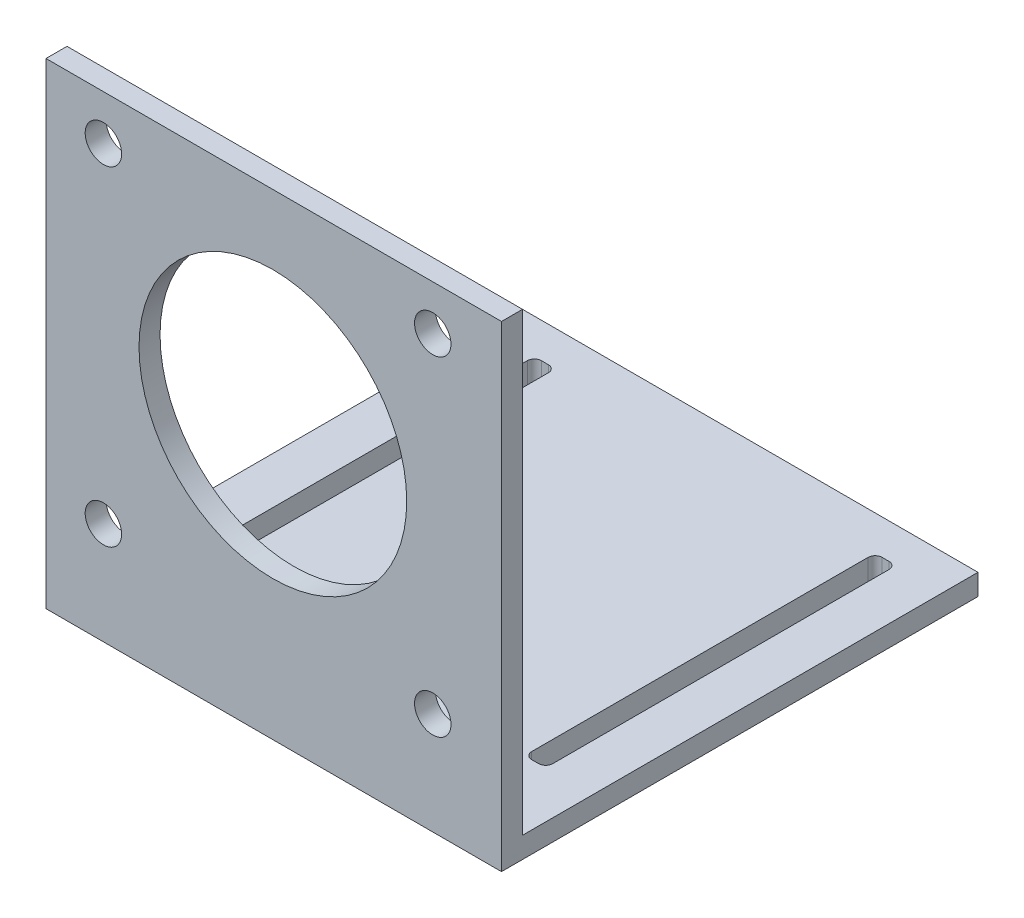
ISO-10303-21;
HEADER;
FILE_DESCRIPTION(('STEP AP214'),'2;1');
FILE_NAME('part.step','',(''),(''),'','','');
FILE_SCHEMA(('AUTOMOTIVE_DESIGN { 1 0 10303 214 1 1 1 1 }'));
ENDSEC;
DATA;
#1=APPLICATION_CONTEXT('core data for automotive mechanical design processes');
#2=APPLICATION_PROTOCOL_DEFINITION('international standard','automotive_design',2000,#1);
#3=PRODUCT_CONTEXT('',#1,'mechanical');
#4=PRODUCT('Part','Part','',(#3));
#5=PRODUCT_RELATED_PRODUCT_CATEGORY('part','',(#4));
#6=PRODUCT_DEFINITION_FORMATION('','',#4);
#7=PRODUCT_DEFINITION_CONTEXT('part definition',#1,'design');
#8=PRODUCT_DEFINITION('design','',#6,#7);
#9=PRODUCT_DEFINITION_SHAPE('','',#8);
#10=(LENGTH_UNIT() NAMED_UNIT(*) SI_UNIT(.MILLI.,.METRE.));
#11=(NAMED_UNIT(*) PLANE_ANGLE_UNIT() SI_UNIT($,.RADIAN.));
#12=(NAMED_UNIT(*) SI_UNIT($,.STERADIAN.) SOLID_ANGLE_UNIT());
#13=UNCERTAINTY_MEASURE_WITH_UNIT(LENGTH_MEASURE(1.E-05),#10,'distance_accuracy_value','');
#14=(GEOMETRIC_REPRESENTATION_CONTEXT(3) GLOBAL_UNCERTAINTY_ASSIGNED_CONTEXT((#13)) GLOBAL_UNIT_ASSIGNED_CONTEXT((#10,
#11,#12)) REPRESENTATION_CONTEXT('',''));
#15=CARTESIAN_POINT('',(0.,0.,0.));
#16=DIRECTION('',(0.,0.,1.));
#17=DIRECTION('',(1.,0.,0.));
#18=AXIS2_PLACEMENT_3D('',#15,#16,#17);
#19=CARTESIAN_POINT('',(65.,58.3348706702819,3.70617289525367));
#20=DIRECTION('',(0.,-1.,0.));
#21=DIRECTION('',(0.,0.,-1.));
#22=AXIS2_PLACEMENT_3D('',#19,#20,#21);
#23=PLANE('',#22);
#24=DIRECTION('',(0.,0.,1.));
#25=VECTOR('',#24,1.);
#26=CARTESIAN_POINT('',(0.,58.3348706702819,3.70617289525367));
#27=LINE('',#26,#25);
#28=CARTESIAN_POINT('',(0.,58.3348706702819,3.70617289525367));
#29=VERTEX_POINT('',#28);
#30=CARTESIAN_POINT('',(0.,58.3348706702819,6.70617289525367));
#31=VERTEX_POINT('',#30);
#32=EDGE_CURVE('E216',#29,#31,#27,.T.);
#33=ORIENTED_EDGE('',*,*,#32,.T.);
#34=DIRECTION('',(-1.,0.,0.));
#35=VECTOR('',#34,1.);
#36=CARTESIAN_POINT('',(65.,58.3348706702819,6.70617289525367));
#37=LINE('',#36,#35);
#38=CARTESIAN_POINT('',(65.,58.3348706702819,6.70617289525367));
#39=VERTEX_POINT('',#38);
#40=EDGE_CURVE('E197',#39,#31,#37,.T.);
#41=ORIENTED_EDGE('',*,*,#40,.F.);
#42=DIRECTION('',(0.,0.,1.));
#43=VECTOR('',#42,1.);
#44=CARTESIAN_POINT('',(65.,58.3348706702819,3.70617289525367));
#45=LINE('',#44,#43);
#46=CARTESIAN_POINT('',(65.,58.3348706702819,3.70617289525367));
#47=VERTEX_POINT('',#46);
#48=EDGE_CURVE('E204',#47,#39,#45,.T.);
#49=ORIENTED_EDGE('',*,*,#48,.F.);
#50=DIRECTION('',(-1.,0.,0.));
#51=VECTOR('',#50,1.);
#52=CARTESIAN_POINT('',(65.,58.3348706702819,3.70617289525367));
#53=LINE('',#52,#51);
#54=EDGE_CURVE('E367',#47,#29,#53,.T.);
#55=ORIENTED_EDGE('',*,*,#54,.T.);
#56=EDGE_LOOP('',(#33,#41,#49,#55));
#57=FACE_BOUND('',#56,.T.);
#58=ADVANCED_FACE('F43',(#57),#23,.F.);
#59=CARTESIAN_POINT('',(65.,58.3348706702819,6.70617289525367));
#60=DIRECTION('',(0.,0.,-1.));
#61=DIRECTION('',(0.,1.,0.));
#62=AXIS2_PLACEMENT_3D('',#59,#60,#61);
#63=PLANE('',#62);
#64=CARTESIAN_POINT('',(55.1908587835836,4.92574766118378,6.70617289525366));
#65=DIRECTION('',(0.,0.,1.));
#66=DIRECTION('',(1.,0.,0.));
#67=AXIS2_PLACEMENT_3D('',#64,#65,#66);
#68=CIRCLE('',#67,2.6);
#69=CARTESIAN_POINT('',(57.7908587835836,4.92574766118378,6.70617289525366));
#70=VERTEX_POINT('',#69);
#71=EDGE_CURVE('E348',#70,#70,#68,.T.);
#72=ORIENTED_EDGE('',*,*,#71,.F.);
#73=EDGE_LOOP('',(#72));
#74=FACE_BOUND('',#73,.T.);
#75=CARTESIAN_POINT('',(8.19085878358356,4.92574766118378,6.70617289525366));
#76=DIRECTION('',(0.,0.,1.));
#77=DIRECTION('',(1.,0.,0.));
#78=AXIS2_PLACEMENT_3D('',#75,#76,#77);
#79=CIRCLE('',#78,2.6);
#80=CARTESIAN_POINT('',(10.7908587835836,4.92574766118378,6.70617289525366));
#81=VERTEX_POINT('',#80);
#82=EDGE_CURVE('E356',#81,#81,#79,.T.);
#83=ORIENTED_EDGE('',*,*,#82,.F.);
#84=EDGE_LOOP('',(#83));
#85=FACE_BOUND('',#84,.T.);
#86=CARTESIAN_POINT('',(55.1908587835836,51.9257476611838,6.70617289525366));
#87=DIRECTION('',(0.,0.,1.));
#88=DIRECTION('',(1.,0.,0.));
#89=AXIS2_PLACEMENT_3D('',#86,#87,#88);
#90=CIRCLE('',#89,2.6);
#91=CARTESIAN_POINT('',(57.7908587835836,51.9257476611838,6.70617289525366));
#92=VERTEX_POINT('',#91);
#93=EDGE_CURVE('E352',#92,#92,#90,.T.);
#94=ORIENTED_EDGE('',*,*,#93,.F.);
#95=EDGE_LOOP('',(#94));
#96=FACE_BOUND('',#95,.T.);
#97=CARTESIAN_POINT('',(8.19085878358356,51.9257476611838,6.70617289525366));
#98=DIRECTION('',(0.,0.,1.));
#99=DIRECTION('',(1.,0.,0.));
#100=AXIS2_PLACEMENT_3D('',#97,#98,#99);
#101=CIRCLE('',#100,2.59999999999999);
#102=CARTESIAN_POINT('',(10.7908587835836,51.9257476611838,6.70617289525366));
#103=VERTEX_POINT('',#102);
#104=EDGE_CURVE('E353',#103,#103,#101,.T.);
#105=ORIENTED_EDGE('',*,*,#104,.F.);
#106=EDGE_LOOP('',(#105));
#107=FACE_BOUND('',#106,.T.);
#108=CARTESIAN_POINT('',(32.3749814943053,29.3348706702819,6.70617289525366));
#109=DIRECTION('',(0.,0.,1.));
#110=DIRECTION('',(1.,0.,0.));
#111=AXIS2_PLACEMENT_3D('',#108,#109,#110);
#112=CIRCLE('',#111,19.1);
#113=CARTESIAN_POINT('',(51.4749814943053,29.3348706702819,6.70617289525366));
#114=VERTEX_POINT('',#113);
#115=EDGE_CURVE('E227',#114,#114,#112,.T.);
#116=ORIENTED_EDGE('',*,*,#115,.F.);
#117=EDGE_LOOP('',(#116));
#118=FACE_BOUND('',#117,.T.);
#119=DIRECTION('',(0.,-1.,0.));
#120=VECTOR('',#119,1.);
#121=CARTESIAN_POINT('',(0.,58.3348706702819,6.70617289525367));
#122=LINE('',#121,#120);
#123=CARTESIAN_POINT('',(0.,-9.66512932971814,6.70617289525366));
#124=VERTEX_POINT('',#123);
#125=EDGE_CURVE('E375',#31,#124,#122,.T.);
#126=ORIENTED_EDGE('',*,*,#125,.T.);
#127=DIRECTION('',(-1.,0.,0.));
#128=VECTOR('',#127,1.);
#129=CARTESIAN_POINT('',(65.,-9.66512932971814,6.70617289525366));
#130=LINE('',#129,#128);
#131=CARTESIAN_POINT('',(65.,-9.66512932971814,6.70617289525366));
#132=VERTEX_POINT('',#131);
#133=EDGE_CURVE('E199',#132,#124,#130,.T.);
#134=ORIENTED_EDGE('',*,*,#133,.F.);
#135=DIRECTION('',(0.,-1.,0.));
#136=VECTOR('',#135,1.);
#137=CARTESIAN_POINT('',(65.,58.3348706702819,6.70617289525367));
#138=LINE('',#137,#136);
#139=EDGE_CURVE('E195',#39,#132,#138,.T.);
#140=ORIENTED_EDGE('',*,*,#139,.F.);
#141=ORIENTED_EDGE('',*,*,#40,.T.);
#142=EDGE_LOOP('',(#126,#134,#140,#141));
#143=FACE_BOUND('',#142,.T.);
#144=ADVANCED_FACE('F192',(#74,#85,#96,#107,#118,#143),#63,.F.);
#145=CARTESIAN_POINT('',(65.,-9.66512932971814,6.70617289525366));
#146=DIRECTION('',(0.,1.,0.));
#147=DIRECTION('',(0.,0.,1.));
#148=AXIS2_PLACEMENT_3D('',#145,#146,#147);
#149=PLANE('',#148);
#150=DIRECTION('',(0.,0.,-1.));
#151=VECTOR('',#150,1.);
#152=CARTESIAN_POINT('',(9.69,-9.66512932971814,6.70617289525367));
#153=LINE('',#152,#151);
#154=CARTESIAN_POINT('',(9.69,-9.66512932971814,-7.29382710474633));
#155=VERTEX_POINT('',#154);
#156=CARTESIAN_POINT('',(9.69,-9.66512932971814,-55.2938271047463));
#157=VERTEX_POINT('',#156);
#158=EDGE_CURVE('E344',#155,#157,#153,.T.);
#159=ORIENTED_EDGE('',*,*,#158,.T.);
#160=CARTESIAN_POINT('',(8.69,-9.66512932971814,-55.2938271047463));
#161=DIRECTION('',(0.,1.,0.));
#162=DIRECTION('',(0.,0.,1.));
#163=AXIS2_PLACEMENT_3D('',#160,#161,#162);
#164=CIRCLE('',#163,1.);
#165=CARTESIAN_POINT('',(8.69,-9.66512932971814,-56.2938271047464));
#166=VERTEX_POINT('',#165);
#167=EDGE_CURVE('E286',#157,#166,#164,.T.);
#168=ORIENTED_EDGE('',*,*,#167,.T.);
#169=DIRECTION('',(-1.,0.,0.));
#170=VECTOR('',#169,1.);
#171=CARTESIAN_POINT('',(65.,-9.66512932971814,-56.2938271047464));
#172=LINE('',#171,#170);
#173=CARTESIAN_POINT('',(7.69,-9.66512932971814,-56.2938271047464));
#174=VERTEX_POINT('',#173);
#175=EDGE_CURVE('E343',#166,#174,#172,.T.);
#176=ORIENTED_EDGE('',*,*,#175,.T.);
#177=CARTESIAN_POINT('',(7.69,-9.66512932971814,-55.2938271047463));
#178=DIRECTION('',(0.,1.,0.));
#179=DIRECTION('',(0.,0.,1.));
#180=AXIS2_PLACEMENT_3D('',#177,#178,#179);
#181=CIRCLE('',#180,1.);
#182=CARTESIAN_POINT('',(6.69,-9.66512932971814,-55.2938271047463));
#183=VERTEX_POINT('',#182);
#184=EDGE_CURVE('E292',#174,#183,#181,.T.);
#185=ORIENTED_EDGE('',*,*,#184,.T.);
#186=DIRECTION('',(0.,0.,1.));
#187=VECTOR('',#186,1.);
#188=CARTESIAN_POINT('',(6.69000000000001,-9.66512932971814,6.70617289525367));
#189=LINE('',#188,#187);
#190=CARTESIAN_POINT('',(6.69000000000001,-9.66512932971814,-7.29382710474633));
#191=VERTEX_POINT('',#190);
#192=EDGE_CURVE('E350',#183,#191,#189,.T.);
#193=ORIENTED_EDGE('',*,*,#192,.T.);
#194=CARTESIAN_POINT('',(7.69000000000001,-9.66512932971814,-7.29382710474633));
#195=DIRECTION('',(0.,1.,0.));
#196=DIRECTION('',(0.,0.,1.));
#197=AXIS2_PLACEMENT_3D('',#194,#195,#196);
#198=CIRCLE('',#197,1.);
#199=CARTESIAN_POINT('',(7.69000000000001,-9.66512932971814,-6.29382710474633));
#200=VERTEX_POINT('',#199);
#201=EDGE_CURVE('E281',#191,#200,#198,.T.);
#202=ORIENTED_EDGE('',*,*,#201,.T.);
#203=DIRECTION('',(1.,0.,0.));
#204=VECTOR('',#203,1.);
#205=CARTESIAN_POINT('',(65.,-9.66512932971814,-6.29382710474633));
#206=LINE('',#205,#204);
#207=CARTESIAN_POINT('',(8.69,-9.66512932971814,-6.29382710474633));
#208=VERTEX_POINT('',#207);
#209=EDGE_CURVE('E336',#200,#208,#206,.T.);
#210=ORIENTED_EDGE('',*,*,#209,.T.);
#211=CARTESIAN_POINT('',(8.69,-9.66512932971814,-7.29382710474633));
#212=DIRECTION('',(0.,1.,0.));
#213=DIRECTION('',(0.,0.,1.));
#214=AXIS2_PLACEMENT_3D('',#211,#212,#213);
#215=CIRCLE('',#214,1.);
#216=EDGE_CURVE('E276',#208,#155,#215,.T.);
#217=ORIENTED_EDGE('',*,*,#216,.T.);
#218=EDGE_LOOP('',(#159,#168,#176,#185,#193,#202,#210,#217));
#219=FACE_BOUND('',#218,.T.);
#220=DIRECTION('',(0.,0.,-1.));
#221=VECTOR('',#220,1.);
#222=CARTESIAN_POINT('',(58.31,-9.66512932971814,6.70617289525366));
#223=LINE('',#222,#221);
#224=CARTESIAN_POINT('',(58.31,-9.66512932971814,-7.29382710474633));
#225=VERTEX_POINT('',#224);
#226=CARTESIAN_POINT('',(58.31,-9.66512932971814,-55.2938271047463));
#227=VERTEX_POINT('',#226);
#228=EDGE_CURVE('E325',#225,#227,#223,.T.);
#229=ORIENTED_EDGE('',*,*,#228,.T.);
#230=CARTESIAN_POINT('',(57.31,-9.66512932971814,-55.2938271047463));
#231=DIRECTION('',(0.,1.,0.));
#232=DIRECTION('',(0.,0.,1.));
#233=AXIS2_PLACEMENT_3D('',#230,#231,#232);
#234=CIRCLE('',#233,1.);
#235=CARTESIAN_POINT('',(57.31,-9.66512932971814,-56.2938271047464));
#236=VERTEX_POINT('',#235);
#237=EDGE_CURVE('E297',#227,#236,#234,.T.);
#238=ORIENTED_EDGE('',*,*,#237,.T.);
#239=DIRECTION('',(-1.,0.,0.));
#240=VECTOR('',#239,1.);
#241=CARTESIAN_POINT('',(65.,-9.66512932971814,-56.2938271047464));
#242=LINE('',#241,#240);
#243=CARTESIAN_POINT('',(56.31,-9.66512932971814,-56.2938271047464));
#244=VERTEX_POINT('',#243);
#245=EDGE_CURVE('E327',#236,#244,#242,.T.);
#246=ORIENTED_EDGE('',*,*,#245,.T.);
#247=CARTESIAN_POINT('',(56.31,-9.66512932971814,-55.2938271047463));
#248=DIRECTION('',(0.,1.,0.));
#249=DIRECTION('',(0.,0.,1.));
#250=AXIS2_PLACEMENT_3D('',#247,#248,#249);
#251=CIRCLE('',#250,1.);
#252=CARTESIAN_POINT('',(55.31,-9.66512932971814,-55.2938271047463));
#253=VERTEX_POINT('',#252);
#254=EDGE_CURVE('E293',#244,#253,#251,.T.);
#255=ORIENTED_EDGE('',*,*,#254,.T.);
#256=DIRECTION('',(0.,0.,1.));
#257=VECTOR('',#256,1.);
#258=CARTESIAN_POINT('',(55.31,-9.66512932971814,6.70617289525366));
#259=LINE('',#258,#257);
#260=CARTESIAN_POINT('',(55.31,-9.66512932971814,-7.29382710474633));
#261=VERTEX_POINT('',#260);
#262=EDGE_CURVE('E332',#253,#261,#259,.T.);
#263=ORIENTED_EDGE('',*,*,#262,.T.);
#264=CARTESIAN_POINT('',(56.31,-9.66512932971814,-7.29382710474633));
#265=DIRECTION('',(0.,1.,0.));
#266=DIRECTION('',(0.,0.,1.));
#267=AXIS2_PLACEMENT_3D('',#264,#265,#266);
#268=CIRCLE('',#267,1.);
#269=CARTESIAN_POINT('',(56.31,-9.66512932971814,-6.29382710474633));
#270=VERTEX_POINT('',#269);
#271=EDGE_CURVE('E64',#261,#270,#268,.T.);
#272=ORIENTED_EDGE('',*,*,#271,.T.);
#273=DIRECTION('',(1.,0.,0.));
#274=VECTOR('',#273,1.);
#275=CARTESIAN_POINT('',(65.,-9.66512932971814,-6.29382710474633));
#276=LINE('',#275,#274);
#277=CARTESIAN_POINT('',(57.31,-9.66512932971814,-6.29382710474633));
#278=VERTEX_POINT('',#277);
#279=EDGE_CURVE('E322',#270,#278,#276,.T.);
#280=ORIENTED_EDGE('',*,*,#279,.T.);
#281=CARTESIAN_POINT('',(57.31,-9.66512932971814,-7.29382710474633));
#282=DIRECTION('',(0.,1.,0.));
#283=DIRECTION('',(0.,0.,1.));
#284=AXIS2_PLACEMENT_3D('',#281,#282,#283);
#285=CIRCLE('',#284,1.);
#286=EDGE_CURVE('E11',#278,#225,#285,.T.);
#287=ORIENTED_EDGE('',*,*,#286,.T.);
#288=EDGE_LOOP('',(#229,#238,#246,#255,#263,#272,#280,#287));
#289=FACE_BOUND('',#288,.T.);
#290=DIRECTION('',(0.,0.,-1.));
#291=VECTOR('',#290,1.);
#292=CARTESIAN_POINT('',(0.,-9.66512932971814,6.70617289525366));
#293=LINE('',#292,#291);
#294=CARTESIAN_POINT('',(0.,-9.66512932971814,-61.2938271047463));
#295=VERTEX_POINT('',#294);
#296=EDGE_CURVE('E372',#124,#295,#293,.T.);
#297=ORIENTED_EDGE('',*,*,#296,.T.);
#298=DIRECTION('',(-1.,0.,0.));
#299=VECTOR('',#298,1.);
#300=CARTESIAN_POINT('',(65.,-9.66512932971814,-61.2938271047463));
#301=LINE('',#300,#299);
#302=CARTESIAN_POINT('',(65.,-9.66512932971814,-61.2938271047463));
#303=VERTEX_POINT('',#302);
#304=EDGE_CURVE('E222',#303,#295,#301,.T.);
#305=ORIENTED_EDGE('',*,*,#304,.F.);
#306=DIRECTION('',(0.,0.,-1.));
#307=VECTOR('',#306,1.);
#308=CARTESIAN_POINT('',(65.,-9.66512932971814,6.70617289525366));
#309=LINE('',#308,#307);
#310=EDGE_CURVE('E201',#132,#303,#309,.T.);
#311=ORIENTED_EDGE('',*,*,#310,.F.);
#312=ORIENTED_EDGE('',*,*,#133,.T.);
#313=EDGE_LOOP('',(#297,#305,#311,#312));
#314=FACE_BOUND('',#313,.T.);
#315=ADVANCED_FACE('F319',(#219,#289,#314),#149,.F.);
#316=CARTESIAN_POINT('',(65.,-9.66512932971814,-61.2938271047463));
#317=DIRECTION('',(0.,0.,1.));
#318=DIRECTION('',(1.,0.,0.));
#319=AXIS2_PLACEMENT_3D('',#316,#317,#318);
#320=PLANE('',#319);
#321=DIRECTION('',(0.,1.,0.));
#322=VECTOR('',#321,1.);
#323=CARTESIAN_POINT('',(0.,-9.66512932971814,-61.2938271047463));
#324=LINE('',#323,#322);
#325=CARTESIAN_POINT('',(0.,-6.66512932971814,-61.2938271047463));
#326=VERTEX_POINT('',#325);
#327=EDGE_CURVE('E376',#295,#326,#324,.T.);
#328=ORIENTED_EDGE('',*,*,#327,.T.);
#329=DIRECTION('',(-1.,0.,0.));
#330=VECTOR('',#329,1.);
#331=CARTESIAN_POINT('',(65.,-6.66512932971814,-61.2938271047463));
#332=LINE('',#331,#330);
#333=CARTESIAN_POINT('',(65.,-6.66512932971814,-61.2938271047463));
#334=VERTEX_POINT('',#333);
#335=EDGE_CURVE('E384',#334,#326,#332,.T.);
#336=ORIENTED_EDGE('',*,*,#335,.F.);
#337=DIRECTION('',(0.,1.,0.));
#338=VECTOR('',#337,1.);
#339=CARTESIAN_POINT('',(65.,-9.66512932971814,-61.2938271047463));
#340=LINE('',#339,#338);
#341=EDGE_CURVE('E364',#303,#334,#340,.T.);
#342=ORIENTED_EDGE('',*,*,#341,.F.);
#343=ORIENTED_EDGE('',*,*,#304,.T.);
#344=EDGE_LOOP('',(#328,#336,#342,#343));
#345=FACE_BOUND('',#344,.T.);
#346=ADVANCED_FACE('F395',(#345),#320,.F.);
#347=CARTESIAN_POINT('',(65.,-6.66512932971814,-61.2938271047463));
#348=DIRECTION('',(0.,-1.,0.));
#349=DIRECTION('',(0.,0.,-1.));
#350=AXIS2_PLACEMENT_3D('',#347,#348,#349);
#351=PLANE('',#350);
#352=DIRECTION('',(1.,0.,0.));
#353=VECTOR('',#352,1.);
#354=CARTESIAN_POINT('',(6.69000000000001,-6.66512932971813,-6.29382710474633));
#355=LINE('',#354,#353);
#356=CARTESIAN_POINT('',(7.69000000000001,-6.66512932971813,-6.29382710474633));
#357=VERTEX_POINT('',#356);
#358=CARTESIAN_POINT('',(8.69,-6.66512932971813,-6.29382710474633));
#359=VERTEX_POINT('',#358);
#360=EDGE_CURVE('E459',#357,#359,#355,.T.);
#361=ORIENTED_EDGE('',*,*,#360,.F.);
#362=CARTESIAN_POINT('',(7.69000000000001,-6.66512932971813,-7.29382710474633));
#363=DIRECTION('',(0.,-1.,0.));
#364=DIRECTION('',(0.,0.,-1.));
#365=AXIS2_PLACEMENT_3D('',#362,#363,#364);
#366=CIRCLE('',#365,1.);
#367=CARTESIAN_POINT('',(6.69000000000001,-6.66512932971813,-7.29382710474633));
#368=VERTEX_POINT('',#367);
#369=EDGE_CURVE('E283',#357,#368,#366,.T.);
#370=ORIENTED_EDGE('',*,*,#369,.T.);
#371=DIRECTION('',(0.,0.,1.));
#372=VECTOR('',#371,1.);
#373=CARTESIAN_POINT('',(6.69,-6.66512932971814,-56.2938271047463));
#374=LINE('',#373,#372);
#375=CARTESIAN_POINT('',(6.69,-6.66512932971814,-55.2938271047463));
#376=VERTEX_POINT('',#375);
#377=EDGE_CURVE('E460',#376,#368,#374,.T.);
#378=ORIENTED_EDGE('',*,*,#377,.F.);
#379=CARTESIAN_POINT('',(7.69,-6.66512932971814,-55.2938271047463));
#380=DIRECTION('',(0.,-1.,0.));
#381=DIRECTION('',(0.,0.,-1.));
#382=AXIS2_PLACEMENT_3D('',#379,#380,#381);
#383=CIRCLE('',#382,1.);
#384=CARTESIAN_POINT('',(7.69,-6.66512932971814,-56.2938271047463));
#385=VERTEX_POINT('',#384);
#386=EDGE_CURVE('E288',#376,#385,#383,.T.);
#387=ORIENTED_EDGE('',*,*,#386,.T.);
#388=DIRECTION('',(-1.,0.,0.));
#389=VECTOR('',#388,1.);
#390=CARTESIAN_POINT('',(6.69,-6.66512932971814,-56.2938271047463));
#391=LINE('',#390,#389);
#392=CARTESIAN_POINT('',(8.69,-6.66512932971814,-56.2938271047463));
#393=VERTEX_POINT('',#392);
#394=EDGE_CURVE('E334',#393,#385,#391,.T.);
#395=ORIENTED_EDGE('',*,*,#394,.F.);
#396=CARTESIAN_POINT('',(8.69,-6.66512932971814,-55.2938271047463));
#397=DIRECTION('',(0.,-1.,0.));
#398=DIRECTION('',(0.,0.,-1.));
#399=AXIS2_PLACEMENT_3D('',#396,#397,#398);
#400=CIRCLE('',#399,1.);
#401=CARTESIAN_POINT('',(9.69,-6.66512932971814,-55.2938271047463));
#402=VERTEX_POINT('',#401);
#403=EDGE_CURVE('E284',#393,#402,#400,.T.);
#404=ORIENTED_EDGE('',*,*,#403,.T.);
#405=DIRECTION('',(0.,0.,-1.));
#406=VECTOR('',#405,1.);
#407=CARTESIAN_POINT('',(9.69,-6.66512932971814,-56.2938271047463));
#408=LINE('',#407,#406);
#409=CARTESIAN_POINT('',(9.69,-6.66512932971813,-7.29382710474633));
#410=VERTEX_POINT('',#409);
#411=EDGE_CURVE('E470',#410,#402,#408,.T.);
#412=ORIENTED_EDGE('',*,*,#411,.F.);
#413=CARTESIAN_POINT('',(8.69,-6.66512932971813,-7.29382710474633));
#414=DIRECTION('',(0.,-1.,0.));
#415=DIRECTION('',(0.,0.,-1.));
#416=AXIS2_PLACEMENT_3D('',#413,#414,#415);
#417=CIRCLE('',#416,1.);
#418=EDGE_CURVE('E280',#410,#359,#417,.T.);
#419=ORIENTED_EDGE('',*,*,#418,.T.);
#420=EDGE_LOOP('',(#361,#370,#378,#387,#395,#404,#412,#419));
#421=FACE_BOUND('',#420,.T.);
#422=DIRECTION('',(1.,0.,0.));
#423=VECTOR('',#422,1.);
#424=CARTESIAN_POINT('',(55.31,-6.66512932971813,-6.29382710474633));
#425=LINE('',#424,#423);
#426=CARTESIAN_POINT('',(56.31,-6.66512932971813,-6.29382710474633));
#427=VERTEX_POINT('',#426);
#428=CARTESIAN_POINT('',(57.31,-6.66512932971813,-6.29382710474633));
#429=VERTEX_POINT('',#428);
#430=EDGE_CURVE('E306',#427,#429,#425,.T.);
#431=ORIENTED_EDGE('',*,*,#430,.F.);
#432=CARTESIAN_POINT('',(56.31,-6.66512932971813,-7.29382710474633));
#433=DIRECTION('',(0.,-1.,0.));
#434=DIRECTION('',(0.,0.,-1.));
#435=AXIS2_PLACEMENT_3D('',#432,#433,#434);
#436=CIRCLE('',#435,1.);
#437=CARTESIAN_POINT('',(55.31,-6.66512932971813,-7.29382710474633));
#438=VERTEX_POINT('',#437);
#439=EDGE_CURVE('E304',#427,#438,#436,.T.);
#440=ORIENTED_EDGE('',*,*,#439,.T.);
#441=DIRECTION('',(0.,0.,1.));
#442=VECTOR('',#441,1.);
#443=CARTESIAN_POINT('',(55.31,-6.66512932971814,-56.2938271047463));
#444=LINE('',#443,#442);
#445=CARTESIAN_POINT('',(55.31,-6.66512932971814,-55.2938271047463));
#446=VERTEX_POINT('',#445);
#447=EDGE_CURVE('E312',#446,#438,#444,.T.);
#448=ORIENTED_EDGE('',*,*,#447,.F.);
#449=CARTESIAN_POINT('',(56.31,-6.66512932971814,-55.2938271047463));
#450=DIRECTION('',(0.,-1.,0.));
#451=DIRECTION('',(0.,0.,-1.));
#452=AXIS2_PLACEMENT_3D('',#449,#450,#451);
#453=CIRCLE('',#452,1.);
#454=CARTESIAN_POINT('',(56.31,-6.66512932971814,-56.2938271047463));
#455=VERTEX_POINT('',#454);
#456=EDGE_CURVE('E291',#446,#455,#453,.T.);
#457=ORIENTED_EDGE('',*,*,#456,.T.);
#458=DIRECTION('',(-1.,0.,0.));
#459=VECTOR('',#458,1.);
#460=CARTESIAN_POINT('',(55.31,-6.66512932971814,-56.2938271047463));
#461=LINE('',#460,#459);
#462=CARTESIAN_POINT('',(57.31,-6.66512932971814,-56.2938271047463));
#463=VERTEX_POINT('',#462);
#464=EDGE_CURVE('E461',#463,#455,#461,.T.);
#465=ORIENTED_EDGE('',*,*,#464,.F.);
#466=CARTESIAN_POINT('',(57.31,-6.66512932971814,-55.2938271047463));
#467=DIRECTION('',(0.,-1.,0.));
#468=DIRECTION('',(0.,0.,-1.));
#469=AXIS2_PLACEMENT_3D('',#466,#467,#468);
#470=CIRCLE('',#469,1.);
#471=CARTESIAN_POINT('',(58.31,-6.66512932971814,-55.2938271047463));
#472=VERTEX_POINT('',#471);
#473=EDGE_CURVE('E300',#463,#472,#470,.T.);
#474=ORIENTED_EDGE('',*,*,#473,.T.);
#475=DIRECTION('',(0.,0.,-1.));
#476=VECTOR('',#475,1.);
#477=CARTESIAN_POINT('',(58.31,-6.66512932971814,-56.2938271047463));
#478=LINE('',#477,#476);
#479=CARTESIAN_POINT('',(58.31,-6.66512932971813,-7.29382710474633));
#480=VERTEX_POINT('',#479);
#481=EDGE_CURVE('E309',#480,#472,#478,.T.);
#482=ORIENTED_EDGE('',*,*,#481,.F.);
#483=CARTESIAN_POINT('',(57.31,-6.66512932971813,-7.29382710474633));
#484=DIRECTION('',(0.,-1.,0.));
#485=DIRECTION('',(0.,0.,-1.));
#486=AXIS2_PLACEMENT_3D('',#483,#484,#485);
#487=CIRCLE('',#486,1.);
#488=EDGE_CURVE('E51',#480,#429,#487,.T.);
#489=ORIENTED_EDGE('',*,*,#488,.T.);
#490=EDGE_LOOP('',(#431,#440,#448,#457,#465,#474,#482,#489));
#491=FACE_BOUND('',#490,.T.);
#492=DIRECTION('',(0.,0.,1.));
#493=VECTOR('',#492,1.);
#494=CARTESIAN_POINT('',(0.,-6.66512932971814,-61.2938271047463));
#495=LINE('',#494,#493);
#496=CARTESIAN_POINT('',(0.,-6.66512932971813,3.70617289525367));
#497=VERTEX_POINT('',#496);
#498=EDGE_CURVE('E378',#326,#497,#495,.T.);
#499=ORIENTED_EDGE('',*,*,#498,.T.);
#500=DIRECTION('',(-1.,0.,0.));
#501=VECTOR('',#500,1.);
#502=CARTESIAN_POINT('',(65.,-6.66512932971813,3.70617289525367));
#503=LINE('',#502,#501);
#504=CARTESIAN_POINT('',(65.,-6.66512932971813,3.70617289525367));
#505=VERTEX_POINT('',#504);
#506=EDGE_CURVE('E385',#505,#497,#503,.T.);
#507=ORIENTED_EDGE('',*,*,#506,.F.);
#508=DIRECTION('',(0.,0.,1.));
#509=VECTOR('',#508,1.);
#510=CARTESIAN_POINT('',(65.,-6.66512932971814,-61.2938271047463));
#511=LINE('',#510,#509);
#512=EDGE_CURVE('E370',#334,#505,#511,.T.);
#513=ORIENTED_EDGE('',*,*,#512,.F.);
#514=ORIENTED_EDGE('',*,*,#335,.T.);
#515=EDGE_LOOP('',(#499,#507,#513,#514));
#516=FACE_BOUND('',#515,.T.);
#517=ADVANCED_FACE('F308',(#421,#491,#516),#351,.F.);
#518=CARTESIAN_POINT('',(65.,-6.66512932971813,3.70617289525367));
#519=DIRECTION('',(0.,0.,1.));
#520=DIRECTION('',(0.,-1.,0.));
#521=AXIS2_PLACEMENT_3D('',#518,#519,#520);
#522=PLANE('',#521);
#523=CARTESIAN_POINT('',(55.1908587835836,4.92574766118378,3.70617289525367));
#524=DIRECTION('',(0.,0.,1.));
#525=DIRECTION('',(0.,-1.,0.));
#526=AXIS2_PLACEMENT_3D('',#523,#524,#525);
#527=CIRCLE('',#526,2.6);
#528=CARTESIAN_POINT('',(55.1908587835836,2.32574766118379,3.70617289525367));
#529=VERTEX_POINT('',#528);
#530=EDGE_CURVE('E236',#529,#529,#527,.T.);
#531=ORIENTED_EDGE('',*,*,#530,.T.);
#532=EDGE_LOOP('',(#531));
#533=FACE_BOUND('',#532,.T.);
#534=CARTESIAN_POINT('',(8.19085878358356,4.92574766118378,3.70617289525367));
#535=DIRECTION('',(0.,0.,1.));
#536=DIRECTION('',(0.,-1.,0.));
#537=AXIS2_PLACEMENT_3D('',#534,#535,#536);
#538=CIRCLE('',#537,2.6);
#539=CARTESIAN_POINT('',(8.19085878358356,2.32574766118378,3.70617289525367));
#540=VERTEX_POINT('',#539);
#541=EDGE_CURVE('E232',#540,#540,#538,.T.);
#542=ORIENTED_EDGE('',*,*,#541,.T.);
#543=EDGE_LOOP('',(#542));
#544=FACE_BOUND('',#543,.T.);
#545=CARTESIAN_POINT('',(55.1908587835836,51.9257476611838,3.70617289525367));
#546=DIRECTION('',(0.,0.,1.));
#547=DIRECTION('',(0.,-1.,0.));
#548=AXIS2_PLACEMENT_3D('',#545,#546,#547);
#549=CIRCLE('',#548,2.6);
#550=CARTESIAN_POINT('',(55.1908587835836,49.3257476611838,3.70617289525367));
#551=VERTEX_POINT('',#550);
#552=EDGE_CURVE('E231',#551,#551,#549,.T.);
#553=ORIENTED_EDGE('',*,*,#552,.T.);
#554=EDGE_LOOP('',(#553));
#555=FACE_BOUND('',#554,.T.);
#556=CARTESIAN_POINT('',(8.19085878358356,51.9257476611838,3.70617289525367));
#557=DIRECTION('',(0.,0.,1.));
#558=DIRECTION('',(0.,-1.,0.));
#559=AXIS2_PLACEMENT_3D('',#556,#557,#558);
#560=CIRCLE('',#559,2.59999999999999);
#561=CARTESIAN_POINT('',(8.19085878358356,49.3257476611838,3.70617289525367));
#562=VERTEX_POINT('',#561);
#563=EDGE_CURVE('E226',#562,#562,#560,.T.);
#564=ORIENTED_EDGE('',*,*,#563,.T.);
#565=EDGE_LOOP('',(#564));
#566=FACE_BOUND('',#565,.T.);
#567=CARTESIAN_POINT('',(32.3749814943053,29.3348706702819,3.70617289525367));
#568=DIRECTION('',(0.,0.,1.));
#569=DIRECTION('',(0.,-1.,0.));
#570=AXIS2_PLACEMENT_3D('',#567,#568,#569);
#571=CIRCLE('',#570,19.1);
#572=CARTESIAN_POINT('',(32.3749814943053,10.2348706702819,3.70617289525367));
#573=VERTEX_POINT('',#572);
#574=EDGE_CURVE('E223',#573,#573,#571,.T.);
#575=ORIENTED_EDGE('',*,*,#574,.T.);
#576=EDGE_LOOP('',(#575));
#577=FACE_BOUND('',#576,.T.);
#578=DIRECTION('',(0.,1.,0.));
#579=VECTOR('',#578,1.);
#580=CARTESIAN_POINT('',(0.,-6.66512932971813,3.70617289525367));
#581=LINE('',#580,#579);
#582=EDGE_CURVE('E213',#497,#29,#581,.T.);
#583=ORIENTED_EDGE('',*,*,#582,.T.);
#584=ORIENTED_EDGE('',*,*,#54,.F.);
#585=DIRECTION('',(0.,1.,0.));
#586=VECTOR('',#585,1.);
#587=CARTESIAN_POINT('',(65.,-6.66512932971813,3.70617289525367));
#588=LINE('',#587,#586);
#589=EDGE_CURVE('E207',#505,#47,#588,.T.);
#590=ORIENTED_EDGE('',*,*,#589,.F.);
#591=ORIENTED_EDGE('',*,*,#506,.T.);
#592=EDGE_LOOP('',(#583,#584,#590,#591));
#593=FACE_BOUND('',#592,.T.);
#594=ADVANCED_FACE('F405',(#533,#544,#555,#566,#577,#593),#522,.F.);
#595=CARTESIAN_POINT('',(65.,0.,0.));
#596=DIRECTION('',(1.,0.,0.));
#597=DIRECTION('',(0.,0.,-1.));
#598=AXIS2_PLACEMENT_3D('',#595,#596,#597);
#599=PLANE('',#598);
#600=ORIENTED_EDGE('',*,*,#48,.T.);
#601=ORIENTED_EDGE('',*,*,#139,.T.);
#602=ORIENTED_EDGE('',*,*,#310,.T.);
#603=ORIENTED_EDGE('',*,*,#341,.T.);
#604=ORIENTED_EDGE('',*,*,#512,.T.);
#605=ORIENTED_EDGE('',*,*,#589,.T.);
#606=EDGE_LOOP('',(#600,#601,#602,#603,#604,#605));
#607=FACE_BOUND('',#606,.T.);
#608=ADVANCED_FACE('F210',(#607),#599,.T.);
#609=CARTESIAN_POINT('',(0.,0.,0.));
#610=DIRECTION('',(1.,0.,0.));
#611=DIRECTION('',(0.,0.,-1.));
#612=AXIS2_PLACEMENT_3D('',#609,#610,#611);
#613=PLANE('',#612);
#614=ORIENTED_EDGE('',*,*,#32,.F.);
#615=ORIENTED_EDGE('',*,*,#582,.F.);
#616=ORIENTED_EDGE('',*,*,#498,.F.);
#617=ORIENTED_EDGE('',*,*,#327,.F.);
#618=ORIENTED_EDGE('',*,*,#296,.F.);
#619=ORIENTED_EDGE('',*,*,#125,.F.);
#620=EDGE_LOOP('',(#614,#615,#616,#617,#618,#619));
#621=FACE_BOUND('',#620,.T.);
#622=ADVANCED_FACE('F396',(#621),#613,.F.);
#623=CARTESIAN_POINT('',(32.3749814943053,29.3348706702819,-58.2938271047463));
#624=DIRECTION('',(0.,0.,1.));
#625=DIRECTION('',(1.,0.,0.));
#626=AXIS2_PLACEMENT_3D('',#623,#624,#625);
#627=CYLINDRICAL_SURFACE('',#626,19.1);
#628=ORIENTED_EDGE('',*,*,#115,.T.);
#629=EDGE_LOOP('',(#628));
#630=FACE_BOUND('',#629,.T.);
#631=ORIENTED_EDGE('',*,*,#574,.F.);
#632=EDGE_LOOP('',(#631));
#633=FACE_BOUND('',#632,.T.);
#634=ADVANCED_FACE('F507',(#630,#633),#627,.F.);
#635=CARTESIAN_POINT('',(8.19085878358356,51.9257476611838,-58.2938271047463));
#636=DIRECTION('',(0.,0.,1.));
#637=DIRECTION('',(1.,0.,0.));
#638=AXIS2_PLACEMENT_3D('',#635,#636,#637);
#639=CYLINDRICAL_SURFACE('',#638,2.59999999999999);
#640=ORIENTED_EDGE('',*,*,#104,.T.);
#641=EDGE_LOOP('',(#640));
#642=FACE_BOUND('',#641,.T.);
#643=ORIENTED_EDGE('',*,*,#563,.F.);
#644=EDGE_LOOP('',(#643));
#645=FACE_BOUND('',#644,.T.);
#646=ADVANCED_FACE('F513',(#642,#645),#639,.F.);
#647=CARTESIAN_POINT('',(55.1908587835836,51.9257476611838,-58.2938271047463));
#648=DIRECTION('',(0.,0.,1.));
#649=DIRECTION('',(1.,0.,0.));
#650=AXIS2_PLACEMENT_3D('',#647,#648,#649);
#651=CYLINDRICAL_SURFACE('',#650,2.6);
#652=ORIENTED_EDGE('',*,*,#93,.T.);
#653=EDGE_LOOP('',(#652));
#654=FACE_BOUND('',#653,.T.);
#655=ORIENTED_EDGE('',*,*,#552,.F.);
#656=EDGE_LOOP('',(#655));
#657=FACE_BOUND('',#656,.T.);
#658=ADVANCED_FACE('F525',(#654,#657),#651,.F.);
#659=CARTESIAN_POINT('',(8.19085878358356,4.92574766118378,-58.2938271047463));
#660=DIRECTION('',(0.,0.,1.));
#661=DIRECTION('',(1.,0.,0.));
#662=AXIS2_PLACEMENT_3D('',#659,#660,#661);
#663=CYLINDRICAL_SURFACE('',#662,2.6);
#664=ORIENTED_EDGE('',*,*,#82,.T.);
#665=EDGE_LOOP('',(#664));
#666=FACE_BOUND('',#665,.T.);
#667=ORIENTED_EDGE('',*,*,#541,.F.);
#668=EDGE_LOOP('',(#667));
#669=FACE_BOUND('',#668,.T.);
#670=ADVANCED_FACE('F517',(#666,#669),#663,.F.);
#671=CARTESIAN_POINT('',(55.1908587835836,4.92574766118378,-58.2938271047463));
#672=DIRECTION('',(0.,0.,1.));
#673=DIRECTION('',(1.,0.,0.));
#674=AXIS2_PLACEMENT_3D('',#671,#672,#673);
#675=CYLINDRICAL_SURFACE('',#674,2.6);
#676=ORIENTED_EDGE('',*,*,#71,.T.);
#677=EDGE_LOOP('',(#676));
#678=FACE_BOUND('',#677,.T.);
#679=ORIENTED_EDGE('',*,*,#530,.F.);
#680=EDGE_LOOP('',(#679));
#681=FACE_BOUND('',#680,.T.);
#682=ADVANCED_FACE('F520',(#678,#681),#675,.F.);
#683=CARTESIAN_POINT('',(55.31,-16.6651293297181,-56.2938271047463));
#684=DIRECTION('',(-1.,0.,0.));
#685=DIRECTION('',(0.,0.,1.));
#686=AXIS2_PLACEMENT_3D('',#683,#684,#685);
#687=PLANE('',#686);
#688=ORIENTED_EDGE('',*,*,#262,.F.);
#689=DIRECTION('',(0.,1.,0.));
#690=VECTOR('',#689,1.);
#691=CARTESIAN_POINT('',(55.31,-6.66512932971814,-55.2938271047463));
#692=LINE('',#691,#690);
#693=EDGE_CURVE('E257',#253,#446,#692,.T.);
#694=ORIENTED_EDGE('',*,*,#693,.T.);
#695=ORIENTED_EDGE('',*,*,#447,.T.);
#696=DIRECTION('',(0.,1.,0.));
#697=VECTOR('',#696,1.);
#698=CARTESIAN_POINT('',(55.31,-9.66512932971814,-7.29382710474633));
#699=LINE('',#698,#697);
#700=EDGE_CURVE('E256',#438,#261,#699,.F.);
#701=ORIENTED_EDGE('',*,*,#700,.T.);
#702=EDGE_LOOP('',(#688,#694,#695,#701));
#703=FACE_BOUND('',#702,.T.);
#704=ADVANCED_FACE('F452',(#703),#687,.F.);
#705=CARTESIAN_POINT('',(55.31,-16.6651293297181,-56.2938271047463));
#706=DIRECTION('',(0.,0.,-1.));
#707=DIRECTION('',(0.,1.,0.));
#708=AXIS2_PLACEMENT_3D('',#705,#706,#707);
#709=PLANE('',#708);
#710=ORIENTED_EDGE('',*,*,#464,.T.);
#711=DIRECTION('',(0.,1.,0.));
#712=VECTOR('',#711,1.);
#713=CARTESIAN_POINT('',(56.31,-9.66512932971814,-56.2938271047463));
#714=LINE('',#713,#712);
#715=EDGE_CURVE('E266',#455,#244,#714,.F.);
#716=ORIENTED_EDGE('',*,*,#715,.T.);
#717=ORIENTED_EDGE('',*,*,#245,.F.);
#718=DIRECTION('',(0.,1.,0.));
#719=VECTOR('',#718,1.);
#720=CARTESIAN_POINT('',(57.31,-6.66512932971814,-56.2938271047463));
#721=LINE('',#720,#719);
#722=EDGE_CURVE('E263',#236,#463,#721,.T.);
#723=ORIENTED_EDGE('',*,*,#722,.T.);
#724=EDGE_LOOP('',(#710,#716,#717,#723));
#725=FACE_BOUND('',#724,.T.);
#726=ADVANCED_FACE('F533',(#725),#709,.F.);
#727=CARTESIAN_POINT('',(58.31,-16.6651293297181,-56.2938271047463));
#728=DIRECTION('',(1.,0.,0.));
#729=DIRECTION('',(0.,0.,-1.));
#730=AXIS2_PLACEMENT_3D('',#727,#728,#729);
#731=PLANE('',#730);
#732=ORIENTED_EDGE('',*,*,#481,.T.);
#733=DIRECTION('',(0.,1.,0.));
#734=VECTOR('',#733,1.);
#735=CARTESIAN_POINT('',(58.31,-9.66512932971814,-55.2938271047463));
#736=LINE('',#735,#734);
#737=EDGE_CURVE('E271',#472,#227,#736,.F.);
#738=ORIENTED_EDGE('',*,*,#737,.T.);
#739=ORIENTED_EDGE('',*,*,#228,.F.);
#740=DIRECTION('',(0.,1.,0.));
#741=VECTOR('',#740,1.);
#742=CARTESIAN_POINT('',(58.31,-6.66512932971813,-7.29382710474633));
#743=LINE('',#742,#741);
#744=EDGE_CURVE('E268',#225,#480,#743,.T.);
#745=ORIENTED_EDGE('',*,*,#744,.T.);
#746=EDGE_LOOP('',(#732,#738,#739,#745));
#747=FACE_BOUND('',#746,.T.);
#748=ADVANCED_FACE('F326',(#747),#731,.F.);
#749=CARTESIAN_POINT('',(55.31,-16.6651293297181,-6.29382710474633));
#750=DIRECTION('',(0.,0.,1.));
#751=DIRECTION('',(0.,-1.,0.));
#752=AXIS2_PLACEMENT_3D('',#749,#750,#751);
#753=PLANE('',#752);
#754=ORIENTED_EDGE('',*,*,#279,.F.);
#755=DIRECTION('',(0.,1.,0.));
#756=VECTOR('',#755,1.);
#757=CARTESIAN_POINT('',(56.31,-6.66512932971813,-6.29382710474633));
#758=LINE('',#757,#756);
#759=EDGE_CURVE('E273',#270,#427,#758,.T.);
#760=ORIENTED_EDGE('',*,*,#759,.T.);
#761=ORIENTED_EDGE('',*,*,#430,.T.);
#762=DIRECTION('',(0.,1.,0.));
#763=VECTOR('',#762,1.);
#764=CARTESIAN_POINT('',(57.31,-9.66512932971814,-6.29382710474633));
#765=LINE('',#764,#763);
#766=EDGE_CURVE('E59',#429,#278,#765,.F.);
#767=ORIENTED_EDGE('',*,*,#766,.T.);
#768=EDGE_LOOP('',(#754,#760,#761,#767));
#769=FACE_BOUND('',#768,.T.);
#770=ADVANCED_FACE('F311',(#769),#753,.F.);
#771=CARTESIAN_POINT('',(6.69,-16.6651293297181,-56.2938271047463));
#772=DIRECTION('',(-1.,0.,0.));
#773=DIRECTION('',(0.,0.,1.));
#774=AXIS2_PLACEMENT_3D('',#771,#772,#773);
#775=PLANE('',#774);
#776=ORIENTED_EDGE('',*,*,#377,.T.);
#777=DIRECTION('',(0.,1.,0.));
#778=VECTOR('',#777,1.);
#779=CARTESIAN_POINT('',(6.69000000000001,-9.66512932971814,-7.29382710474633));
#780=LINE('',#779,#778);
#781=EDGE_CURVE('E253',#368,#191,#780,.F.);
#782=ORIENTED_EDGE('',*,*,#781,.T.);
#783=ORIENTED_EDGE('',*,*,#192,.F.);
#784=DIRECTION('',(0.,1.,0.));
#785=VECTOR('',#784,1.);
#786=CARTESIAN_POINT('',(6.69,-6.66512932971814,-55.2938271047463));
#787=LINE('',#786,#785);
#788=EDGE_CURVE('E250',#183,#376,#787,.T.);
#789=ORIENTED_EDGE('',*,*,#788,.T.);
#790=EDGE_LOOP('',(#776,#782,#783,#789));
#791=FACE_BOUND('',#790,.T.);
#792=ADVANCED_FACE('F500',(#791),#775,.F.);
#793=CARTESIAN_POINT('',(6.69,-16.6651293297181,-56.2938271047463));
#794=DIRECTION('',(0.,0.,-1.));
#795=DIRECTION('',(0.,1.,0.));
#796=AXIS2_PLACEMENT_3D('',#793,#794,#795);
#797=PLANE('',#796);
#798=ORIENTED_EDGE('',*,*,#175,.F.);
#799=DIRECTION('',(0.,1.,0.));
#800=VECTOR('',#799,1.);
#801=CARTESIAN_POINT('',(8.69,-6.66512932971814,-56.2938271047463));
#802=LINE('',#801,#800);
#803=EDGE_CURVE('E254',#166,#393,#802,.T.);
#804=ORIENTED_EDGE('',*,*,#803,.T.);
#805=ORIENTED_EDGE('',*,*,#394,.T.);
#806=DIRECTION('',(0.,1.,0.));
#807=VECTOR('',#806,1.);
#808=CARTESIAN_POINT('',(7.69,-9.66512932971814,-56.2938271047463));
#809=LINE('',#808,#807);
#810=EDGE_CURVE('E251',#385,#174,#809,.F.);
#811=ORIENTED_EDGE('',*,*,#810,.T.);
#812=EDGE_LOOP('',(#798,#804,#805,#811));
#813=FACE_BOUND('',#812,.T.);
#814=ADVANCED_FACE('F489',(#813),#797,.F.);
#815=CARTESIAN_POINT('',(9.69,-16.6651293297181,-56.2938271047463));
#816=DIRECTION('',(1.,0.,0.));
#817=DIRECTION('',(0.,0.,-1.));
#818=AXIS2_PLACEMENT_3D('',#815,#816,#817);
#819=PLANE('',#818);
#820=ORIENTED_EDGE('',*,*,#158,.F.);
#821=DIRECTION('',(0.,1.,0.));
#822=VECTOR('',#821,1.);
#823=CARTESIAN_POINT('',(9.69,-6.66512932971813,-7.29382710474633));
#824=LINE('',#823,#822);
#825=EDGE_CURVE('E218',#155,#410,#824,.T.);
#826=ORIENTED_EDGE('',*,*,#825,.T.);
#827=ORIENTED_EDGE('',*,*,#411,.T.);
#828=DIRECTION('',(0.,1.,0.));
#829=VECTOR('',#828,1.);
#830=CARTESIAN_POINT('',(9.69,-9.66512932971814,-55.2938271047463));
#831=LINE('',#830,#829);
#832=EDGE_CURVE('E220',#402,#157,#831,.F.);
#833=ORIENTED_EDGE('',*,*,#832,.T.);
#834=EDGE_LOOP('',(#820,#826,#827,#833));
#835=FACE_BOUND('',#834,.T.);
#836=ADVANCED_FACE('F483',(#835),#819,.F.);
#837=CARTESIAN_POINT('',(6.69000000000001,-16.6651293297181,-6.29382710474633));
#838=DIRECTION('',(0.,0.,1.));
#839=DIRECTION('',(0.,-1.,0.));
#840=AXIS2_PLACEMENT_3D('',#837,#838,#839);
#841=PLANE('',#840);
#842=ORIENTED_EDGE('',*,*,#360,.T.);
#843=DIRECTION('',(0.,1.,0.));
#844=VECTOR('',#843,1.);
#845=CARTESIAN_POINT('',(8.69,-9.66512932971814,-6.29382710474633));
#846=LINE('',#845,#844);
#847=EDGE_CURVE('E249',#359,#208,#846,.F.);
#848=ORIENTED_EDGE('',*,*,#847,.T.);
#849=ORIENTED_EDGE('',*,*,#209,.F.);
#850=DIRECTION('',(0.,1.,0.));
#851=VECTOR('',#850,1.);
#852=CARTESIAN_POINT('',(7.69000000000001,-6.66512932971813,-6.29382710474633));
#853=LINE('',#852,#851);
#854=EDGE_CURVE('E241',#200,#357,#853,.T.);
#855=ORIENTED_EDGE('',*,*,#854,.T.);
#856=EDGE_LOOP('',(#842,#848,#849,#855));
#857=FACE_BOUND('',#856,.T.);
#858=ADVANCED_FACE('F424',(#857),#841,.F.);
#859=CARTESIAN_POINT('',(8.69,-16.6651293297181,-7.29382710474633));
#860=DIRECTION('',(0.,-1.,0.));
#861=DIRECTION('',(0.,0.,-1.));
#862=AXIS2_PLACEMENT_3D('',#859,#860,#861);
#863=CYLINDRICAL_SURFACE('',#862,1.);
#864=ORIENTED_EDGE('',*,*,#216,.F.);
#865=ORIENTED_EDGE('',*,*,#847,.F.);
#866=ORIENTED_EDGE('',*,*,#418,.F.);
#867=ORIENTED_EDGE('',*,*,#825,.F.);
#868=EDGE_LOOP('',(#864,#865,#866,#867));
#869=FACE_BOUND('',#868,.T.);
#870=ADVANCED_FACE('F419',(#869),#863,.F.);
#871=CARTESIAN_POINT('',(7.69000000000001,-16.6651293297181,-7.29382710474633));
#872=DIRECTION('',(0.,-1.,0.));
#873=DIRECTION('',(0.,0.,-1.));
#874=AXIS2_PLACEMENT_3D('',#871,#872,#873);
#875=CYLINDRICAL_SURFACE('',#874,1.);
#876=ORIENTED_EDGE('',*,*,#201,.F.);
#877=ORIENTED_EDGE('',*,*,#781,.F.);
#878=ORIENTED_EDGE('',*,*,#369,.F.);
#879=ORIENTED_EDGE('',*,*,#854,.F.);
#880=EDGE_LOOP('',(#876,#877,#878,#879));
#881=FACE_BOUND('',#880,.T.);
#882=ADVANCED_FACE('F421',(#881),#875,.F.);
#883=CARTESIAN_POINT('',(8.69,-16.6651293297181,-55.2938271047463));
#884=DIRECTION('',(0.,-1.,0.));
#885=DIRECTION('',(0.,0.,-1.));
#886=AXIS2_PLACEMENT_3D('',#883,#884,#885);
#887=CYLINDRICAL_SURFACE('',#886,1.);
#888=ORIENTED_EDGE('',*,*,#167,.F.);
#889=ORIENTED_EDGE('',*,*,#832,.F.);
#890=ORIENTED_EDGE('',*,*,#403,.F.);
#891=ORIENTED_EDGE('',*,*,#803,.F.);
#892=EDGE_LOOP('',(#888,#889,#890,#891));
#893=FACE_BOUND('',#892,.T.);
#894=ADVANCED_FACE('F428',(#893),#887,.F.);
#895=CARTESIAN_POINT('',(7.69,-16.6651293297181,-55.2938271047463));
#896=DIRECTION('',(0.,-1.,0.));
#897=DIRECTION('',(0.,0.,-1.));
#898=AXIS2_PLACEMENT_3D('',#895,#896,#897);
#899=CYLINDRICAL_SURFACE('',#898,1.);
#900=ORIENTED_EDGE('',*,*,#184,.F.);
#901=ORIENTED_EDGE('',*,*,#810,.F.);
#902=ORIENTED_EDGE('',*,*,#386,.F.);
#903=ORIENTED_EDGE('',*,*,#788,.F.);
#904=EDGE_LOOP('',(#900,#901,#902,#903));
#905=FACE_BOUND('',#904,.T.);
#906=ADVANCED_FACE('F435',(#905),#899,.F.);
#907=CARTESIAN_POINT('',(56.31,-16.6651293297181,-55.2938271047463));
#908=DIRECTION('',(0.,-1.,0.));
#909=DIRECTION('',(0.,0.,-1.));
#910=AXIS2_PLACEMENT_3D('',#907,#908,#909);
#911=CYLINDRICAL_SURFACE('',#910,1.);
#912=ORIENTED_EDGE('',*,*,#254,.F.);
#913=ORIENTED_EDGE('',*,*,#715,.F.);
#914=ORIENTED_EDGE('',*,*,#456,.F.);
#915=ORIENTED_EDGE('',*,*,#693,.F.);
#916=EDGE_LOOP('',(#912,#913,#914,#915));
#917=FACE_BOUND('',#916,.T.);
#918=ADVANCED_FACE('F436',(#917),#911,.F.);
#919=CARTESIAN_POINT('',(57.31,-16.6651293297181,-55.2938271047463));
#920=DIRECTION('',(0.,-1.,0.));
#921=DIRECTION('',(0.,0.,-1.));
#922=AXIS2_PLACEMENT_3D('',#919,#920,#921);
#923=CYLINDRICAL_SURFACE('',#922,1.);
#924=ORIENTED_EDGE('',*,*,#237,.F.);
#925=ORIENTED_EDGE('',*,*,#737,.F.);
#926=ORIENTED_EDGE('',*,*,#473,.F.);
#927=ORIENTED_EDGE('',*,*,#722,.F.);
#928=EDGE_LOOP('',(#924,#925,#926,#927));
#929=FACE_BOUND('',#928,.T.);
#930=ADVANCED_FACE('F439',(#929),#923,.F.);
#931=CARTESIAN_POINT('',(56.31,-16.6651293297181,-7.29382710474633));
#932=DIRECTION('',(0.,-1.,0.));
#933=DIRECTION('',(0.,0.,-1.));
#934=AXIS2_PLACEMENT_3D('',#931,#932,#933);
#935=CYLINDRICAL_SURFACE('',#934,1.);
#936=ORIENTED_EDGE('',*,*,#271,.F.);
#937=ORIENTED_EDGE('',*,*,#700,.F.);
#938=ORIENTED_EDGE('',*,*,#439,.F.);
#939=ORIENTED_EDGE('',*,*,#759,.F.);
#940=EDGE_LOOP('',(#936,#937,#938,#939));
#941=FACE_BOUND('',#940,.T.);
#942=ADVANCED_FACE('F444',(#941),#935,.F.);
#943=CARTESIAN_POINT('',(57.31,-16.6651293297181,-7.29382710474633));
#944=DIRECTION('',(0.,-1.,0.));
#945=DIRECTION('',(0.,0.,-1.));
#946=AXIS2_PLACEMENT_3D('',#943,#944,#945);
#947=CYLINDRICAL_SURFACE('',#946,1.);
#948=ORIENTED_EDGE('',*,*,#286,.F.);
#949=ORIENTED_EDGE('',*,*,#766,.F.);
#950=ORIENTED_EDGE('',*,*,#488,.F.);
#951=ORIENTED_EDGE('',*,*,#744,.F.);
#952=EDGE_LOOP('',(#948,#949,#950,#951));
#953=FACE_BOUND('',#952,.T.);
#954=ADVANCED_FACE('F44',(#953),#947,.F.);
#955=CLOSED_SHELL('',(#58,#144,#315,#346,#517,#594,#608,#622,#634,#646,#658,#670,#682,#704,#726,
#748,#770,#792,#814,#836,#858,#870,#882,#894,#906,#918,#930,#942,#954));
#956=MANIFOLD_SOLID_BREP('B2',#955);
#957=ADVANCED_BREP_SHAPE_REPRESENTATION('',(#18,#956),#14);
#958=SHAPE_DEFINITION_REPRESENTATION(#9,#957);
ENDSEC;
END-ISO-10303-21;
